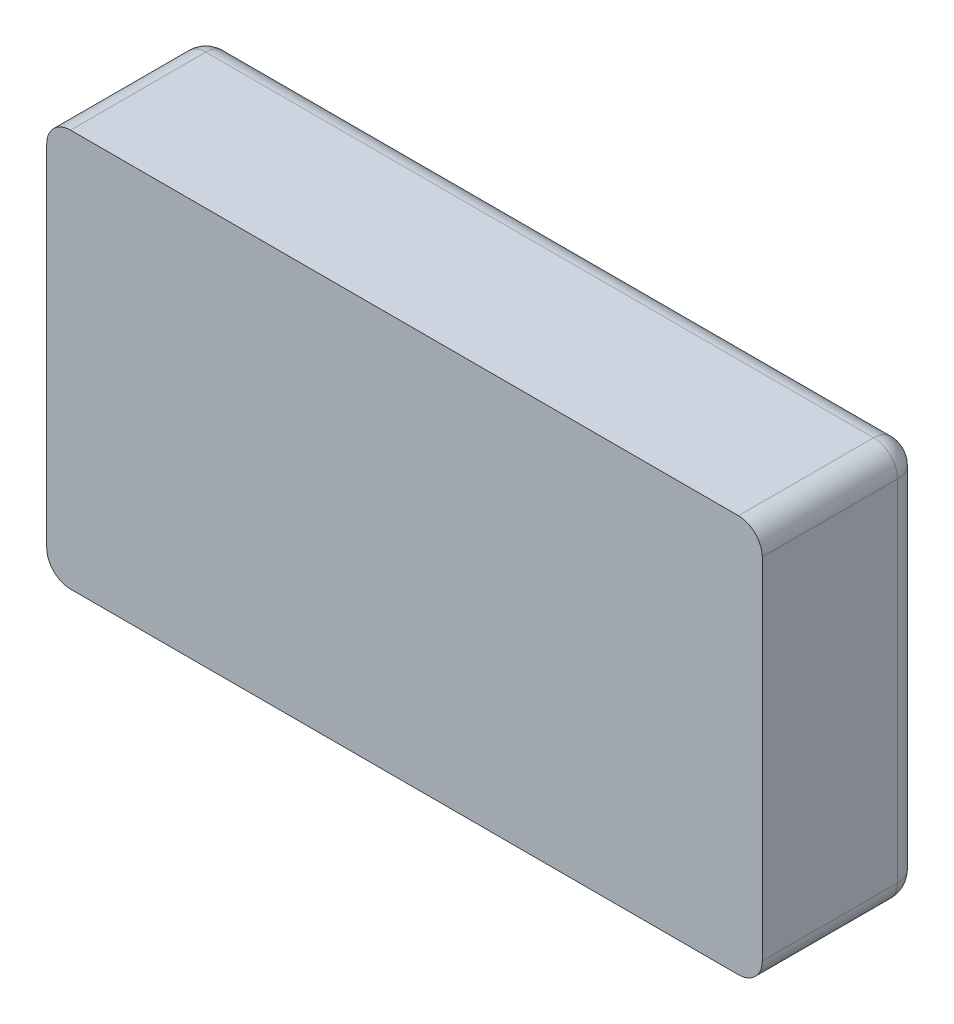
ISO-10303-21;
HEADER;
FILE_DESCRIPTION(('STEP AP214'),'2;1');
FILE_NAME('part.step','',(''),(''),'','','');
FILE_SCHEMA(('AUTOMOTIVE_DESIGN { 1 0 10303 214 1 1 1 1 }'));
ENDSEC;
DATA;
#1=APPLICATION_CONTEXT('core data for automotive mechanical design processes');
#2=APPLICATION_PROTOCOL_DEFINITION('international standard','automotive_design',2000,#1);
#3=PRODUCT_CONTEXT('',#1,'mechanical');
#4=PRODUCT('Part','Part','',(#3));
#5=PRODUCT_RELATED_PRODUCT_CATEGORY('part','',(#4));
#6=PRODUCT_DEFINITION_FORMATION('','',#4);
#7=PRODUCT_DEFINITION_CONTEXT('part definition',#1,'design');
#8=PRODUCT_DEFINITION('design','',#6,#7);
#9=PRODUCT_DEFINITION_SHAPE('','',#8);
#10=(LENGTH_UNIT() NAMED_UNIT(*) SI_UNIT(.MILLI.,.METRE.));
#11=(NAMED_UNIT(*) PLANE_ANGLE_UNIT() SI_UNIT($,.RADIAN.));
#12=(NAMED_UNIT(*) SI_UNIT($,.STERADIAN.) SOLID_ANGLE_UNIT());
#13=UNCERTAINTY_MEASURE_WITH_UNIT(LENGTH_MEASURE(1.E-05),#10,'distance_accuracy_value','');
#14=(GEOMETRIC_REPRESENTATION_CONTEXT(3) GLOBAL_UNCERTAINTY_ASSIGNED_CONTEXT((#13)) GLOBAL_UNIT_ASSIGNED_CONTEXT((#10,
#11,#12)) REPRESENTATION_CONTEXT('',''));
#15=CARTESIAN_POINT('',(0.,0.,0.));
#16=DIRECTION('',(0.,0.,1.));
#17=DIRECTION('',(1.,0.,0.));
#18=AXIS2_PLACEMENT_3D('',#15,#16,#17);
#19=CARTESIAN_POINT('',(0.,0.,2.));
#20=DIRECTION('',(1.,0.,0.));
#21=DIRECTION('',(0.,1.,0.));
#22=AXIS2_PLACEMENT_3D('',#19,#20,#21);
#23=PLANE('',#22);
#24=DIRECTION('',(0.,-1.,0.));
#25=VECTOR('',#24,1.);
#26=CARTESIAN_POINT('',(0.,0.,0.3));
#27=LINE('',#26,#25);
#28=CARTESIAN_POINT('',(0.,-0.3,0.3));
#29=VERTEX_POINT('',#28);
#30=CARTESIAN_POINT('',(0.,-4.7,0.3));
#31=VERTEX_POINT('',#30);
#32=EDGE_CURVE('E125',#29,#31,#27,.T.);
#33=ORIENTED_EDGE('',*,*,#32,.T.);
#34=DIRECTION('',(0.,0.,-1.));
#35=VECTOR('',#34,1.);
#36=CARTESIAN_POINT('',(0.,-4.7,2.));
#37=LINE('',#36,#35);
#38=CARTESIAN_POINT('',(0.,-4.7,2.));
#39=VERTEX_POINT('',#38);
#40=EDGE_CURVE('E134',#31,#39,#37,.F.);
#41=ORIENTED_EDGE('',*,*,#40,.T.);
#42=DIRECTION('',(0.,-1.,0.));
#43=VECTOR('',#42,1.);
#44=CARTESIAN_POINT('',(0.,0.,2.));
#45=LINE('',#44,#43);
#46=CARTESIAN_POINT('',(0.,-0.3,2.));
#47=VERTEX_POINT('',#46);
#48=EDGE_CURVE('E117',#47,#39,#45,.T.);
#49=ORIENTED_EDGE('',*,*,#48,.F.);
#50=DIRECTION('',(0.,0.,-1.));
#51=VECTOR('',#50,1.);
#52=CARTESIAN_POINT('',(0.,-0.3,2.));
#53=LINE('',#52,#51);
#54=EDGE_CURVE('E131',#47,#29,#53,.T.);
#55=ORIENTED_EDGE('',*,*,#54,.T.);
#56=EDGE_LOOP('',(#33,#41,#49,#55));
#57=FACE_BOUND('',#56,.T.);
#58=ADVANCED_FACE('F35',(#57),#23,.F.);
#59=CARTESIAN_POINT('',(0.,-5.,2.));
#60=DIRECTION('',(0.,1.,0.));
#61=DIRECTION('',(0.,0.,1.));
#62=AXIS2_PLACEMENT_3D('',#59,#60,#61);
#63=PLANE('',#62);
#64=DIRECTION('',(1.,0.,0.));
#65=VECTOR('',#64,1.);
#66=CARTESIAN_POINT('',(0.,-5.,2.));
#67=LINE('',#66,#65);
#68=CARTESIAN_POINT('',(0.300000000000002,-5.,2.));
#69=VERTEX_POINT('',#68);
#70=CARTESIAN_POINT('',(8.7,-5.,2.));
#71=VERTEX_POINT('',#70);
#72=EDGE_CURVE('E135',#69,#71,#67,.T.);
#73=ORIENTED_EDGE('',*,*,#72,.F.);
#74=DIRECTION('',(0.,0.,-1.));
#75=VECTOR('',#74,1.);
#76=CARTESIAN_POINT('',(0.300000000000002,-5.,2.));
#77=LINE('',#76,#75);
#78=CARTESIAN_POINT('',(0.300000000000002,-5.,0.3));
#79=VERTEX_POINT('',#78);
#80=EDGE_CURVE('E184',#69,#79,#77,.T.);
#81=ORIENTED_EDGE('',*,*,#80,.T.);
#82=DIRECTION('',(1.,0.,0.));
#83=VECTOR('',#82,1.);
#84=CARTESIAN_POINT('',(0.,-5.,0.3));
#85=LINE('',#84,#83);
#86=CARTESIAN_POINT('',(8.7,-5.,0.3));
#87=VERTEX_POINT('',#86);
#88=EDGE_CURVE('E175',#79,#87,#85,.T.);
#89=ORIENTED_EDGE('',*,*,#88,.T.);
#90=DIRECTION('',(0.,0.,-1.));
#91=VECTOR('',#90,1.);
#92=CARTESIAN_POINT('',(8.7,-5.,2.));
#93=LINE('',#92,#91);
#94=EDGE_CURVE('E182',#87,#71,#93,.F.);
#95=ORIENTED_EDGE('',*,*,#94,.T.);
#96=EDGE_LOOP('',(#73,#81,#89,#95));
#97=FACE_BOUND('',#96,.T.);
#98=ADVANCED_FACE('F216',(#97),#63,.F.);
#99=CARTESIAN_POINT('',(9.,0.,2.));
#100=DIRECTION('',(-1.,0.,0.));
#101=DIRECTION('',(0.,-1.,0.));
#102=AXIS2_PLACEMENT_3D('',#99,#100,#101);
#103=PLANE('',#102);
#104=DIRECTION('',(0.,1.,0.));
#105=VECTOR('',#104,1.);
#106=CARTESIAN_POINT('',(9.,0.,2.));
#107=LINE('',#106,#105);
#108=CARTESIAN_POINT('',(9.,-4.7,2.));
#109=VERTEX_POINT('',#108);
#110=CARTESIAN_POINT('',(9.,-0.3,2.));
#111=VERTEX_POINT('',#110);
#112=EDGE_CURVE('E143',#109,#111,#107,.T.);
#113=ORIENTED_EDGE('',*,*,#112,.F.);
#114=DIRECTION('',(0.,0.,-1.));
#115=VECTOR('',#114,1.);
#116=CARTESIAN_POINT('',(9.,-4.7,2.));
#117=LINE('',#116,#115);
#118=CARTESIAN_POINT('',(9.,-4.7,0.3));
#119=VERTEX_POINT('',#118);
#120=EDGE_CURVE('E59',#109,#119,#117,.T.);
#121=ORIENTED_EDGE('',*,*,#120,.T.);
#122=DIRECTION('',(0.,1.,0.));
#123=VECTOR('',#122,1.);
#124=CARTESIAN_POINT('',(9.,0.,0.3));
#125=LINE('',#124,#123);
#126=CARTESIAN_POINT('',(9.,-0.3,0.3));
#127=VERTEX_POINT('',#126);
#128=EDGE_CURVE('E165',#119,#127,#125,.T.);
#129=ORIENTED_EDGE('',*,*,#128,.T.);
#130=DIRECTION('',(0.,0.,-1.));
#131=VECTOR('',#130,1.);
#132=CARTESIAN_POINT('',(9.,-0.3,2.));
#133=LINE('',#132,#131);
#134=EDGE_CURVE('E156',#127,#111,#133,.F.);
#135=ORIENTED_EDGE('',*,*,#134,.T.);
#136=EDGE_LOOP('',(#113,#121,#129,#135));
#137=FACE_BOUND('',#136,.T.);
#138=ADVANCED_FACE('F221',(#137),#103,.F.);
#139=CARTESIAN_POINT('',(0.,0.,2.));
#140=DIRECTION('',(0.,-1.,0.));
#141=DIRECTION('',(0.,0.,-1.));
#142=AXIS2_PLACEMENT_3D('',#139,#140,#141);
#143=PLANE('',#142);
#144=DIRECTION('',(-1.,0.,0.));
#145=VECTOR('',#144,1.);
#146=CARTESIAN_POINT('',(0.,0.,2.));
#147=LINE('',#146,#145);
#148=CARTESIAN_POINT('',(8.7,0.,2.));
#149=VERTEX_POINT('',#148);
#150=CARTESIAN_POINT('',(0.3,0.,2.));
#151=VERTEX_POINT('',#150);
#152=EDGE_CURVE('E120',#149,#151,#147,.T.);
#153=ORIENTED_EDGE('',*,*,#152,.F.);
#154=DIRECTION('',(0.,0.,-1.));
#155=VECTOR('',#154,1.);
#156=CARTESIAN_POINT('',(8.7,0.,2.));
#157=LINE('',#156,#155);
#158=CARTESIAN_POINT('',(8.7,0.,0.3));
#159=VERTEX_POINT('',#158);
#160=EDGE_CURVE('E171',#149,#159,#157,.T.);
#161=ORIENTED_EDGE('',*,*,#160,.T.);
#162=DIRECTION('',(-1.,0.,0.));
#163=VECTOR('',#162,1.);
#164=CARTESIAN_POINT('',(0.,0.,0.3));
#165=LINE('',#164,#163);
#166=CARTESIAN_POINT('',(0.3,0.,0.3));
#167=VERTEX_POINT('',#166);
#168=EDGE_CURVE('E154',#159,#167,#165,.T.);
#169=ORIENTED_EDGE('',*,*,#168,.T.);
#170=DIRECTION('',(0.,0.,-1.));
#171=VECTOR('',#170,1.);
#172=CARTESIAN_POINT('',(0.3,0.,2.));
#173=LINE('',#172,#171);
#174=EDGE_CURVE('E126',#167,#151,#173,.F.);
#175=ORIENTED_EDGE('',*,*,#174,.T.);
#176=EDGE_LOOP('',(#153,#161,#169,#175));
#177=FACE_BOUND('',#176,.T.);
#178=ADVANCED_FACE('F229',(#177),#143,.F.);
#179=CARTESIAN_POINT('',(0.,0.,2.));
#180=DIRECTION('',(0.,0.,1.));
#181=DIRECTION('',(1.,0.,0.));
#182=AXIS2_PLACEMENT_3D('',#179,#180,#181);
#183=PLANE('',#182);
#184=ORIENTED_EDGE('',*,*,#48,.T.);
#185=CARTESIAN_POINT('',(0.300000000000002,-4.7,2.));
#186=DIRECTION('',(0.,0.,1.));
#187=DIRECTION('',(1.,0.,0.));
#188=AXIS2_PLACEMENT_3D('',#185,#186,#187);
#189=CIRCLE('',#188,0.3);
#190=EDGE_CURVE('E190',#39,#69,#189,.T.);
#191=ORIENTED_EDGE('',*,*,#190,.T.);
#192=ORIENTED_EDGE('',*,*,#72,.T.);
#193=CARTESIAN_POINT('',(8.7,-4.7,2.));
#194=DIRECTION('',(0.,0.,1.));
#195=DIRECTION('',(1.,0.,0.));
#196=AXIS2_PLACEMENT_3D('',#193,#194,#195);
#197=CIRCLE('',#196,0.3);
#198=EDGE_CURVE('E188',#71,#109,#197,.T.);
#199=ORIENTED_EDGE('',*,*,#198,.T.);
#200=ORIENTED_EDGE('',*,*,#112,.T.);
#201=CARTESIAN_POINT('',(8.7,-0.3,2.));
#202=DIRECTION('',(0.,0.,1.));
#203=DIRECTION('',(1.,0.,0.));
#204=AXIS2_PLACEMENT_3D('',#201,#202,#203);
#205=CIRCLE('',#204,0.3);
#206=EDGE_CURVE('E173',#111,#149,#205,.T.);
#207=ORIENTED_EDGE('',*,*,#206,.T.);
#208=ORIENTED_EDGE('',*,*,#152,.T.);
#209=CARTESIAN_POINT('',(0.3,-0.3,2.));
#210=DIRECTION('',(0.,0.,1.));
#211=DIRECTION('',(1.,0.,0.));
#212=AXIS2_PLACEMENT_3D('',#209,#210,#211);
#213=CIRCLE('',#212,0.3);
#214=EDGE_CURVE('E114',#151,#47,#213,.T.);
#215=ORIENTED_EDGE('',*,*,#214,.T.);
#216=EDGE_LOOP('',(#184,#191,#192,#199,#200,#207,#208,#215));
#217=FACE_BOUND('',#216,.T.);
#218=ADVANCED_FACE('F116',(#217),#183,.T.);
#219=CARTESIAN_POINT('',(0.,0.,0.));
#220=DIRECTION('',(0.,0.,1.));
#221=DIRECTION('',(1.,0.,0.));
#222=AXIS2_PLACEMENT_3D('',#219,#220,#221);
#223=PLANE('',#222);
#224=DIRECTION('',(0.,1.,0.));
#225=VECTOR('',#224,1.);
#226=CARTESIAN_POINT('',(8.7,0.,0.));
#227=LINE('',#226,#225);
#228=CARTESIAN_POINT('',(8.7,-0.3,0.));
#229=VERTEX_POINT('',#228);
#230=CARTESIAN_POINT('',(8.7,-4.7,0.));
#231=VERTEX_POINT('',#230);
#232=EDGE_CURVE('E167',#229,#231,#227,.F.);
#233=ORIENTED_EDGE('',*,*,#232,.T.);
#234=DIRECTION('',(1.,0.,0.));
#235=VECTOR('',#234,1.);
#236=CARTESIAN_POINT('',(0.,-4.7,0.));
#237=LINE('',#236,#235);
#238=CARTESIAN_POINT('',(0.300000000000002,-4.7,0.));
#239=VERTEX_POINT('',#238);
#240=EDGE_CURVE('E11',#231,#239,#237,.F.);
#241=ORIENTED_EDGE('',*,*,#240,.T.);
#242=DIRECTION('',(0.,-1.,0.));
#243=VECTOR('',#242,1.);
#244=CARTESIAN_POINT('',(0.3,0.,0.));
#245=LINE('',#244,#243);
#246=CARTESIAN_POINT('',(0.3,-0.3,0.));
#247=VERTEX_POINT('',#246);
#248=EDGE_CURVE('E151',#239,#247,#245,.F.);
#249=ORIENTED_EDGE('',*,*,#248,.T.);
#250=DIRECTION('',(-1.,0.,0.));
#251=VECTOR('',#250,1.);
#252=CARTESIAN_POINT('',(0.,-0.3,0.));
#253=LINE('',#252,#251);
#254=EDGE_CURVE('E148',#247,#229,#253,.F.);
#255=ORIENTED_EDGE('',*,*,#254,.T.);
#256=EDGE_LOOP('',(#233,#241,#249,#255));
#257=FACE_BOUND('',#256,.T.);
#258=ADVANCED_FACE('F265',(#257),#223,.F.);
#259=CARTESIAN_POINT('',(0.3,-0.3,2.));
#260=DIRECTION('',(0.,0.,-1.));
#261=DIRECTION('',(-1.,0.,0.));
#262=AXIS2_PLACEMENT_3D('',#259,#260,#261);
#263=CYLINDRICAL_SURFACE('',#262,0.3);
#264=ORIENTED_EDGE('',*,*,#174,.F.);
#265=CARTESIAN_POINT('',(0.3,-0.3,0.3));
#266=DIRECTION('',(0.,0.,-1.));
#267=DIRECTION('',(-1.,0.,0.));
#268=AXIS2_PLACEMENT_3D('',#265,#266,#267);
#269=CIRCLE('',#268,0.3);
#270=EDGE_CURVE('E140',#167,#29,#269,.F.);
#271=ORIENTED_EDGE('',*,*,#270,.T.);
#272=ORIENTED_EDGE('',*,*,#54,.F.);
#273=ORIENTED_EDGE('',*,*,#214,.F.);
#274=EDGE_LOOP('',(#264,#271,#272,#273));
#275=FACE_BOUND('',#274,.T.);
#276=ADVANCED_FACE('F138',(#275),#263,.T.);
#277=CARTESIAN_POINT('',(0.,-0.3,0.3));
#278=DIRECTION('',(-1.,0.,0.));
#279=DIRECTION('',(0.,0.,1.));
#280=AXIS2_PLACEMENT_3D('',#277,#278,#279);
#281=CYLINDRICAL_SURFACE('',#280,0.3);
#282=ORIENTED_EDGE('',*,*,#168,.F.);
#283=CARTESIAN_POINT('',(8.7,-0.3,0.3));
#284=DIRECTION('',(-1.,0.,0.));
#285=DIRECTION('',(0.,0.,1.));
#286=AXIS2_PLACEMENT_3D('',#283,#284,#285);
#287=CIRCLE('',#286,0.3);
#288=EDGE_CURVE('E169',#159,#229,#287,.T.);
#289=ORIENTED_EDGE('',*,*,#288,.T.);
#290=ORIENTED_EDGE('',*,*,#254,.F.);
#291=CARTESIAN_POINT('',(0.3,-0.3,0.3));
#292=DIRECTION('',(-1.,0.,0.));
#293=DIRECTION('',(0.,0.,1.));
#294=AXIS2_PLACEMENT_3D('',#291,#292,#293);
#295=CIRCLE('',#294,0.3);
#296=EDGE_CURVE('E136',#167,#247,#295,.T.);
#297=ORIENTED_EDGE('',*,*,#296,.F.);
#298=EDGE_LOOP('',(#282,#289,#290,#297));
#299=FACE_BOUND('',#298,.T.);
#300=ADVANCED_FACE('F232',(#299),#281,.T.);
#301=CARTESIAN_POINT('',(0.3,-0.3,0.3));
#302=DIRECTION('',(0.,0.,1.));
#303=DIRECTION('',(1.,0.,0.));
#304=AXIS2_PLACEMENT_3D('',#301,#302,#303);
#305=SPHERICAL_SURFACE('',#304,0.3);
#306=ORIENTED_EDGE('',*,*,#270,.F.);
#307=ORIENTED_EDGE('',*,*,#296,.T.);
#308=CARTESIAN_POINT('',(0.3,-0.3,0.3));
#309=DIRECTION('',(0.,-1.,0.));
#310=DIRECTION('',(1.,0.,0.));
#311=AXIS2_PLACEMENT_3D('',#308,#309,#310);
#312=CIRCLE('',#311,0.3);
#313=EDGE_CURVE('E157',#29,#247,#312,.T.);
#314=ORIENTED_EDGE('',*,*,#313,.F.);
#315=EDGE_LOOP('',(#306,#307,#314));
#316=FACE_BOUND('',#315,.T.);
#317=ADVANCED_FACE('F235',(#316),#305,.T.);
#318=CARTESIAN_POINT('',(0.3,0.,0.3));
#319=DIRECTION('',(0.,-1.,0.));
#320=DIRECTION('',(1.,0.,0.));
#321=AXIS2_PLACEMENT_3D('',#318,#319,#320);
#322=CYLINDRICAL_SURFACE('',#321,0.3);
#323=ORIENTED_EDGE('',*,*,#248,.F.);
#324=CARTESIAN_POINT('',(0.300000000000002,-4.7,0.3));
#325=DIRECTION('',(0.,-1.,0.));
#326=DIRECTION('',(1.,0.,0.));
#327=AXIS2_PLACEMENT_3D('',#324,#325,#326);
#328=CIRCLE('',#327,0.3);
#329=EDGE_CURVE('E192',#239,#31,#328,.F.);
#330=ORIENTED_EDGE('',*,*,#329,.T.);
#331=ORIENTED_EDGE('',*,*,#32,.F.);
#332=ORIENTED_EDGE('',*,*,#313,.T.);
#333=EDGE_LOOP('',(#323,#330,#331,#332));
#334=FACE_BOUND('',#333,.T.);
#335=ADVANCED_FACE('F239',(#334),#322,.T.);
#336=CARTESIAN_POINT('',(8.7,-0.3,2.));
#337=DIRECTION('',(0.,0.,-1.));
#338=DIRECTION('',(-1.,0.,0.));
#339=AXIS2_PLACEMENT_3D('',#336,#337,#338);
#340=CYLINDRICAL_SURFACE('',#339,0.3);
#341=CARTESIAN_POINT('',(8.7,-0.3,0.3));
#342=DIRECTION('',(0.,0.,-1.));
#343=DIRECTION('',(-1.,0.,0.));
#344=AXIS2_PLACEMENT_3D('',#341,#342,#343);
#345=CIRCLE('',#344,0.3);
#346=EDGE_CURVE('E160',#159,#127,#345,.T.);
#347=ORIENTED_EDGE('',*,*,#346,.F.);
#348=ORIENTED_EDGE('',*,*,#160,.F.);
#349=ORIENTED_EDGE('',*,*,#206,.F.);
#350=ORIENTED_EDGE('',*,*,#134,.F.);
#351=EDGE_LOOP('',(#347,#348,#349,#350));
#352=FACE_BOUND('',#351,.T.);
#353=ADVANCED_FACE('F225',(#352),#340,.T.);
#354=CARTESIAN_POINT('',(8.7,-0.3,0.3));
#355=DIRECTION('',(0.,0.,1.));
#356=DIRECTION('',(1.,0.,0.));
#357=AXIS2_PLACEMENT_3D('',#354,#355,#356);
#358=SPHERICAL_SURFACE('',#357,0.3);
#359=ORIENTED_EDGE('',*,*,#288,.F.);
#360=ORIENTED_EDGE('',*,*,#346,.T.);
#361=CARTESIAN_POINT('',(8.7,-0.3,0.3));
#362=DIRECTION('',(0.,-1.,0.));
#363=DIRECTION('',(1.,0.,0.));
#364=AXIS2_PLACEMENT_3D('',#361,#362,#363);
#365=CIRCLE('',#364,0.3);
#366=EDGE_CURVE('E176',#229,#127,#365,.T.);
#367=ORIENTED_EDGE('',*,*,#366,.F.);
#368=EDGE_LOOP('',(#359,#360,#367));
#369=FACE_BOUND('',#368,.T.);
#370=ADVANCED_FACE('F275',(#369),#358,.T.);
#371=CARTESIAN_POINT('',(8.7,0.,0.3));
#372=DIRECTION('',(0.,1.,0.));
#373=DIRECTION('',(-1.,0.,0.));
#374=AXIS2_PLACEMENT_3D('',#371,#372,#373);
#375=CYLINDRICAL_SURFACE('',#374,0.3);
#376=ORIENTED_EDGE('',*,*,#128,.F.);
#377=CARTESIAN_POINT('',(8.7,-4.7,0.3));
#378=DIRECTION('',(0.,1.,0.));
#379=DIRECTION('',(-1.,0.,0.));
#380=AXIS2_PLACEMENT_3D('',#377,#378,#379);
#381=CIRCLE('',#380,0.3);
#382=EDGE_CURVE('E44',#119,#231,#381,.T.);
#383=ORIENTED_EDGE('',*,*,#382,.T.);
#384=ORIENTED_EDGE('',*,*,#232,.F.);
#385=ORIENTED_EDGE('',*,*,#366,.T.);
#386=EDGE_LOOP('',(#376,#383,#384,#385));
#387=FACE_BOUND('',#386,.T.);
#388=ADVANCED_FACE('F272',(#387),#375,.T.);
#389=CARTESIAN_POINT('',(8.7,-4.7,2.));
#390=DIRECTION('',(0.,0.,-1.));
#391=DIRECTION('',(-1.,0.,0.));
#392=AXIS2_PLACEMENT_3D('',#389,#390,#391);
#393=CYLINDRICAL_SURFACE('',#392,0.3);
#394=CARTESIAN_POINT('',(8.7,-4.7,0.3));
#395=DIRECTION('',(0.,0.,-1.));
#396=DIRECTION('',(-1.,0.,0.));
#397=AXIS2_PLACEMENT_3D('',#394,#395,#396);
#398=CIRCLE('',#397,0.3);
#399=EDGE_CURVE('E39',#119,#87,#398,.T.);
#400=ORIENTED_EDGE('',*,*,#399,.F.);
#401=ORIENTED_EDGE('',*,*,#120,.F.);
#402=ORIENTED_EDGE('',*,*,#198,.F.);
#403=ORIENTED_EDGE('',*,*,#94,.F.);
#404=EDGE_LOOP('',(#400,#401,#402,#403));
#405=FACE_BOUND('',#404,.T.);
#406=ADVANCED_FACE('F37',(#405),#393,.T.);
#407=CARTESIAN_POINT('',(8.7,-4.7,0.3));
#408=DIRECTION('',(0.,0.,1.));
#409=DIRECTION('',(1.,0.,0.));
#410=AXIS2_PLACEMENT_3D('',#407,#408,#409);
#411=SPHERICAL_SURFACE('',#410,0.3);
#412=ORIENTED_EDGE('',*,*,#382,.F.);
#413=ORIENTED_EDGE('',*,*,#399,.T.);
#414=CARTESIAN_POINT('',(8.7,-4.7,0.3));
#415=DIRECTION('',(-1.,0.,0.));
#416=DIRECTION('',(0.,0.,1.));
#417=AXIS2_PLACEMENT_3D('',#414,#415,#416);
#418=CIRCLE('',#417,0.3);
#419=EDGE_CURVE('E200',#231,#87,#418,.T.);
#420=ORIENTED_EDGE('',*,*,#419,.F.);
#421=EDGE_LOOP('',(#412,#413,#420));
#422=FACE_BOUND('',#421,.T.);
#423=ADVANCED_FACE('F209',(#422),#411,.T.);
#424=CARTESIAN_POINT('',(0.,-4.7,0.3));
#425=DIRECTION('',(1.,0.,0.));
#426=DIRECTION('',(0.,0.,-1.));
#427=AXIS2_PLACEMENT_3D('',#424,#425,#426);
#428=CYLINDRICAL_SURFACE('',#427,0.3);
#429=CARTESIAN_POINT('',(0.300000000000002,-4.7,0.3));
#430=DIRECTION('',(-1.,0.,0.));
#431=DIRECTION('',(0.,0.,1.));
#432=AXIS2_PLACEMENT_3D('',#429,#430,#431);
#433=CIRCLE('',#432,0.3);
#434=EDGE_CURVE('E198',#239,#79,#433,.T.);
#435=ORIENTED_EDGE('',*,*,#434,.F.);
#436=ORIENTED_EDGE('',*,*,#240,.F.);
#437=ORIENTED_EDGE('',*,*,#419,.T.);
#438=ORIENTED_EDGE('',*,*,#88,.F.);
#439=EDGE_LOOP('',(#435,#436,#437,#438));
#440=FACE_BOUND('',#439,.T.);
#441=ADVANCED_FACE('F247',(#440),#428,.T.);
#442=CARTESIAN_POINT('',(0.300000000000002,-4.7,0.3));
#443=DIRECTION('',(0.,0.,1.));
#444=DIRECTION('',(1.,0.,0.));
#445=AXIS2_PLACEMENT_3D('',#442,#443,#444);
#446=SPHERICAL_SURFACE('',#445,0.3);
#447=ORIENTED_EDGE('',*,*,#329,.F.);
#448=ORIENTED_EDGE('',*,*,#434,.T.);
#449=CARTESIAN_POINT('',(0.300000000000002,-4.7,0.3));
#450=DIRECTION('',(0.,0.,1.));
#451=DIRECTION('',(1.,0.,0.));
#452=AXIS2_PLACEMENT_3D('',#449,#450,#451);
#453=CIRCLE('',#452,0.3);
#454=EDGE_CURVE('E196',#31,#79,#453,.T.);
#455=ORIENTED_EDGE('',*,*,#454,.F.);
#456=EDGE_LOOP('',(#447,#448,#455));
#457=FACE_BOUND('',#456,.T.);
#458=ADVANCED_FACE('F245',(#457),#446,.T.);
#459=CARTESIAN_POINT('',(0.300000000000002,-4.7,2.));
#460=DIRECTION('',(0.,0.,-1.));
#461=DIRECTION('',(-1.,0.,0.));
#462=AXIS2_PLACEMENT_3D('',#459,#460,#461);
#463=CYLINDRICAL_SURFACE('',#462,0.3);
#464=ORIENTED_EDGE('',*,*,#190,.F.);
#465=ORIENTED_EDGE('',*,*,#40,.F.);
#466=ORIENTED_EDGE('',*,*,#454,.T.);
#467=ORIENTED_EDGE('',*,*,#80,.F.);
#468=EDGE_LOOP('',(#464,#465,#466,#467));
#469=FACE_BOUND('',#468,.T.);
#470=ADVANCED_FACE('F243',(#469),#463,.T.);
#471=CLOSED_SHELL('',(#58,#98,#138,#178,#218,#258,#276,#300,#317,#335,#353,#370,#388,#406,#423,
#441,#458,#470));
#472=MANIFOLD_SOLID_BREP('B2',#471);
#473=ADVANCED_BREP_SHAPE_REPRESENTATION('',(#18,#472),#14);
#474=SHAPE_DEFINITION_REPRESENTATION(#9,#473);
ENDSEC;
END-ISO-10303-21;
